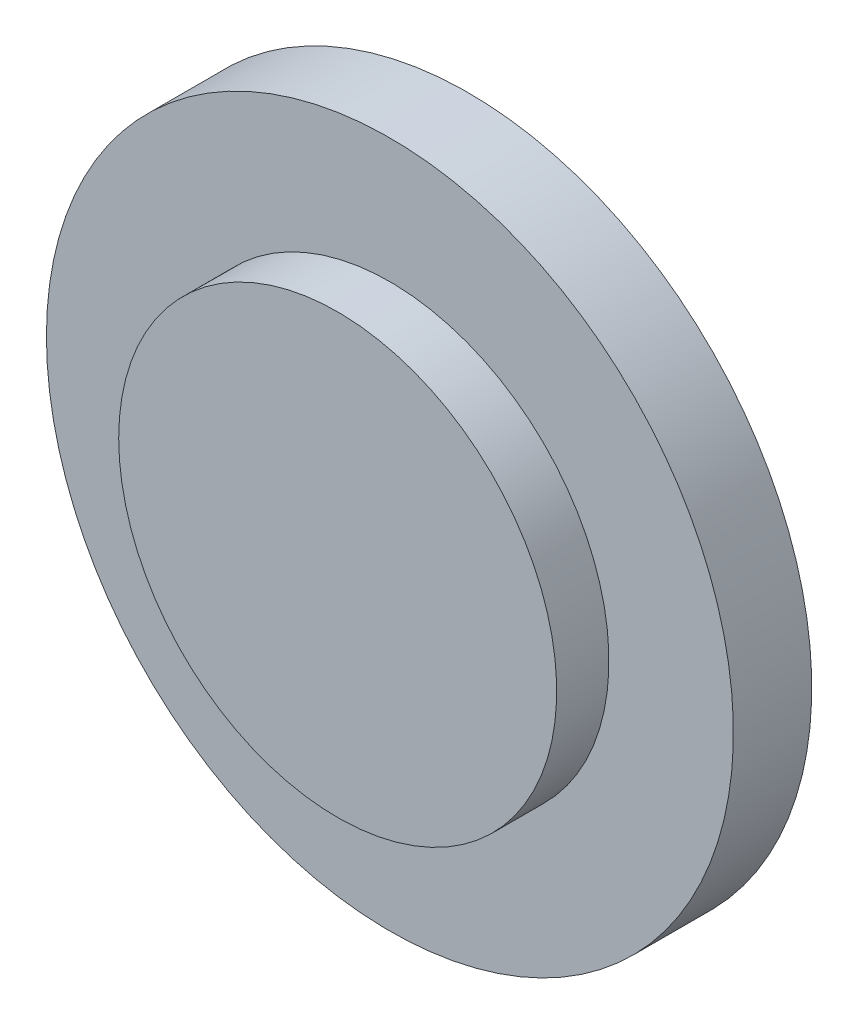
ISO-10303-21;
HEADER;
FILE_DESCRIPTION(('STEP AP214'),'2;1');
FILE_NAME('part.step','',(''),(''),'','','');
FILE_SCHEMA(('AUTOMOTIVE_DESIGN { 1 0 10303 214 1 1 1 1 }'));
ENDSEC;
DATA;
#1=APPLICATION_CONTEXT('core data for automotive mechanical design processes');
#2=APPLICATION_PROTOCOL_DEFINITION('international standard','automotive_design',2000,#1);
#3=PRODUCT_CONTEXT('',#1,'mechanical');
#4=PRODUCT('Part','Part','',(#3));
#5=PRODUCT_RELATED_PRODUCT_CATEGORY('part','',(#4));
#6=PRODUCT_DEFINITION_FORMATION('','',#4);
#7=PRODUCT_DEFINITION_CONTEXT('part definition',#1,'design');
#8=PRODUCT_DEFINITION('design','',#6,#7);
#9=PRODUCT_DEFINITION_SHAPE('','',#8);
#10=(LENGTH_UNIT() NAMED_UNIT(*) SI_UNIT(.MILLI.,.METRE.));
#11=(NAMED_UNIT(*) PLANE_ANGLE_UNIT() SI_UNIT($,.RADIAN.));
#12=(NAMED_UNIT(*) SI_UNIT($,.STERADIAN.) SOLID_ANGLE_UNIT());
#13=UNCERTAINTY_MEASURE_WITH_UNIT(LENGTH_MEASURE(1.E-05),#10,'distance_accuracy_value','');
#14=(GEOMETRIC_REPRESENTATION_CONTEXT(3) GLOBAL_UNCERTAINTY_ASSIGNED_CONTEXT((#13)) GLOBAL_UNIT_ASSIGNED_CONTEXT((#10,
#11,#12)) REPRESENTATION_CONTEXT('',''));
#15=CARTESIAN_POINT('',(0.,0.,0.));
#16=DIRECTION('',(0.,0.,1.));
#17=DIRECTION('',(1.,0.,0.));
#18=AXIS2_PLACEMENT_3D('',#15,#16,#17);
#19=CARTESIAN_POINT('',(17.6132750524146,27.3440147248184,1.5));
#20=DIRECTION('',(0.,0.,1.));
#21=DIRECTION('',(1.,0.,0.));
#22=AXIS2_PLACEMENT_3D('',#19,#20,#21);
#23=PLANE('',#22);
#24=CARTESIAN_POINT('',(18.4618048569795,28.1925445293833,1.5));
#25=DIRECTION('',(0.,0.,-1.));
#26=DIRECTION('',(-1.,0.,0.));
#27=AXIS2_PLACEMENT_3D('',#24,#25,#26);
#28=CIRCLE('',#27,0.83852980456489);
#29=CARTESIAN_POINT('',(17.6232750524146,28.1925445293833,1.5));
#30=VERTEX_POINT('',#29);
#31=EDGE_CURVE('E18',#30,#30,#28,.T.);
#32=ORIENTED_EDGE('',*,*,#31,.F.);
#33=EDGE_LOOP('',(#32));
#34=FACE_BOUND('',#33,.T.);
#35=ADVANCED_FACE('F14',(#34),#23,.T.);
#36=CARTESIAN_POINT('',(18.4618048569795,28.1925445293833,1.5));
#37=DIRECTION('',(0.,0.,-1.));
#38=DIRECTION('',(-1.,0.,0.));
#39=AXIS2_PLACEMENT_3D('',#36,#37,#38);
#40=CYLINDRICAL_SURFACE('',#39,0.83852980456489);
#41=CARTESIAN_POINT('',(18.4618048569795,28.1925445293833,1.3));
#42=DIRECTION('',(0.,0.,-1.));
#43=DIRECTION('',(-1.,0.,0.));
#44=AXIS2_PLACEMENT_3D('',#41,#42,#43);
#45=CIRCLE('',#44,0.83852980456489);
#46=CARTESIAN_POINT('',(17.6232750524146,28.1925445293833,1.3));
#47=VERTEX_POINT('',#46);
#48=EDGE_CURVE('E27',#47,#47,#45,.T.);
#49=ORIENTED_EDGE('',*,*,#48,.F.);
#50=EDGE_LOOP('',(#49));
#51=FACE_BOUND('',#50,.T.);
#52=ORIENTED_EDGE('',*,*,#31,.T.);
#53=EDGE_LOOP('',(#52));
#54=FACE_BOUND('',#53,.T.);
#55=ADVANCED_FACE('F35',(#51,#54),#40,.T.);
#56=CARTESIAN_POINT('',(17.1365730168767,26.8673126892805,1.3));
#57=DIRECTION('',(0.,0.,1.));
#58=DIRECTION('',(1.,0.,0.));
#59=AXIS2_PLACEMENT_3D('',#56,#57,#58);
#60=PLANE('',#59);
#61=ORIENTED_EDGE('',*,*,#48,.T.);
#62=EDGE_LOOP('',(#61));
#63=FACE_BOUND('',#62,.T.);
#64=CARTESIAN_POINT('',(18.4618048569795,28.1925445293833,1.3));
#65=DIRECTION('',(0.,0.,-1.));
#66=DIRECTION('',(-1.,0.,0.));
#67=AXIS2_PLACEMENT_3D('',#64,#65,#66);
#68=CIRCLE('',#67,1.3152318401028);
#69=CARTESIAN_POINT('',(17.1465730168767,28.1925445293833,1.3));
#70=VERTEX_POINT('',#69);
#71=EDGE_CURVE('E22',#70,#70,#68,.T.);
#72=ORIENTED_EDGE('',*,*,#71,.F.);
#73=EDGE_LOOP('',(#72));
#74=FACE_BOUND('',#73,.T.);
#75=ADVANCED_FACE('F43',(#63,#74),#60,.T.);
#76=CARTESIAN_POINT('',(18.4618048569795,28.1925445293833,1.3));
#77=DIRECTION('',(0.,0.,-1.));
#78=DIRECTION('',(-1.,0.,0.));
#79=AXIS2_PLACEMENT_3D('',#76,#77,#78);
#80=CYLINDRICAL_SURFACE('',#79,1.3152318401028);
#81=CARTESIAN_POINT('',(18.4618048569795,28.1925445293833,1.));
#82=DIRECTION('',(0.,0.,-1.));
#83=DIRECTION('',(-1.,0.,0.));
#84=AXIS2_PLACEMENT_3D('',#81,#82,#83);
#85=CIRCLE('',#84,1.3152318401028);
#86=CARTESIAN_POINT('',(17.1465730168767,28.1925445293833,1.));
#87=VERTEX_POINT('',#86);
#88=EDGE_CURVE('E10',#87,#87,#85,.T.);
#89=ORIENTED_EDGE('',*,*,#88,.F.);
#90=EDGE_LOOP('',(#89));
#91=FACE_BOUND('',#90,.T.);
#92=ORIENTED_EDGE('',*,*,#71,.T.);
#93=EDGE_LOOP('',(#92));
#94=FACE_BOUND('',#93,.T.);
#95=ADVANCED_FACE('F47',(#91,#94),#80,.T.);
#96=CARTESIAN_POINT('',(19.7870366970823,26.8673126892805,1.));
#97=DIRECTION('',(0.,0.,-1.));
#98=DIRECTION('',(-1.,0.,0.));
#99=AXIS2_PLACEMENT_3D('',#96,#97,#98);
#100=PLANE('',#99);
#101=ORIENTED_EDGE('',*,*,#88,.T.);
#102=EDGE_LOOP('',(#101));
#103=FACE_BOUND('',#102,.T.);
#104=ADVANCED_FACE('F16',(#103),#100,.T.);
#105=CLOSED_SHELL('',(#35,#55,#75,#95,#104));
#106=MANIFOLD_SOLID_BREP('B1',#105);
#107=ADVANCED_BREP_SHAPE_REPRESENTATION('',(#18,#106),#14);
#108=SHAPE_DEFINITION_REPRESENTATION(#9,#107);
ENDSEC;
END-ISO-10303-21;
